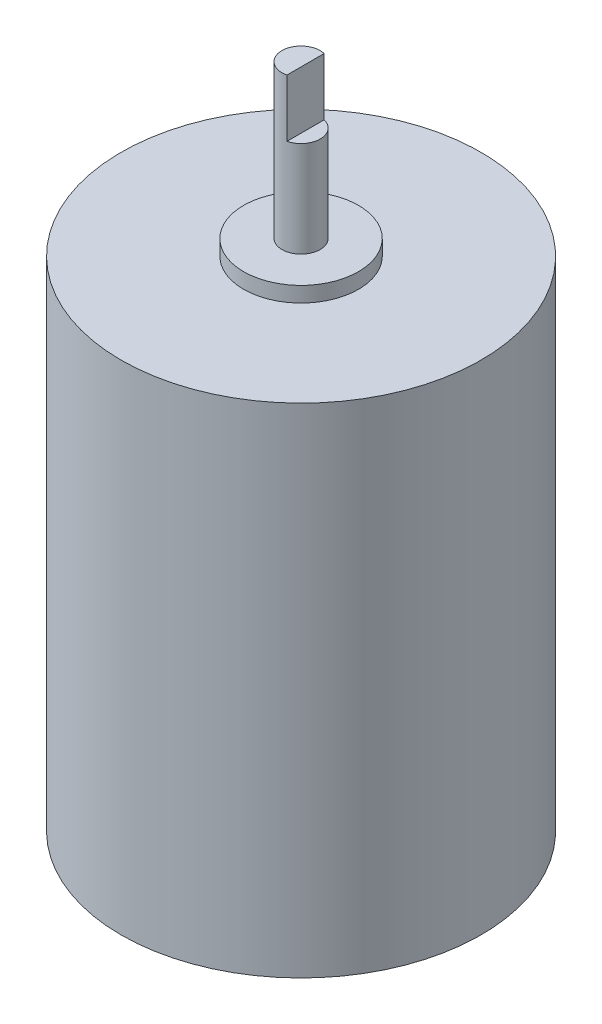
ISO-10303-21;
HEADER;
FILE_DESCRIPTION(('STEP AP214'),'2;1');
FILE_NAME('part.step','',(''),(''),'','','');
FILE_SCHEMA(('AUTOMOTIVE_DESIGN { 1 0 10303 214 1 1 1 1 }'));
ENDSEC;
DATA;
#1=APPLICATION_CONTEXT('core data for automotive mechanical design processes');
#2=APPLICATION_PROTOCOL_DEFINITION('international standard','automotive_design',2000,#1);
#3=PRODUCT_CONTEXT('',#1,'mechanical');
#4=PRODUCT('Part','Part','',(#3));
#5=PRODUCT_RELATED_PRODUCT_CATEGORY('part','',(#4));
#6=PRODUCT_DEFINITION_FORMATION('','',#4);
#7=PRODUCT_DEFINITION_CONTEXT('part definition',#1,'design');
#8=PRODUCT_DEFINITION('design','',#6,#7);
#9=PRODUCT_DEFINITION_SHAPE('','',#8);
#10=(LENGTH_UNIT() NAMED_UNIT(*) SI_UNIT(.MILLI.,.METRE.));
#11=(NAMED_UNIT(*) PLANE_ANGLE_UNIT() SI_UNIT($,.RADIAN.));
#12=(NAMED_UNIT(*) SI_UNIT($,.STERADIAN.) SOLID_ANGLE_UNIT());
#13=UNCERTAINTY_MEASURE_WITH_UNIT(LENGTH_MEASURE(1.E-05),#10,'distance_accuracy_value','');
#14=(GEOMETRIC_REPRESENTATION_CONTEXT(3) GLOBAL_UNCERTAINTY_ASSIGNED_CONTEXT((#13)) GLOBAL_UNIT_ASSIGNED_CONTEXT((#10,
#11,#12)) REPRESENTATION_CONTEXT('',''));
#15=CARTESIAN_POINT('',(0.,0.,0.));
#16=DIRECTION('',(0.,0.,1.));
#17=DIRECTION('',(1.,0.,0.));
#18=AXIS2_PLACEMENT_3D('',#15,#16,#17);
#19=CARTESIAN_POINT('',(0.,65.,0.));
#20=DIRECTION('',(0.,-1.,0.));
#21=DIRECTION('',(0.,0.,-1.));
#22=AXIS2_PLACEMENT_3D('',#19,#20,#21);
#23=CYLINDRICAL_SURFACE('',#22,23.5);
#24=CARTESIAN_POINT('',(0.,65.,0.));
#25=DIRECTION('',(0.,1.,0.));
#26=DIRECTION('',(0.,0.,1.));
#27=AXIS2_PLACEMENT_3D('',#24,#25,#26);
#28=CIRCLE('',#27,23.5);
#29=CARTESIAN_POINT('',(0.,65.,23.5));
#30=VERTEX_POINT('',#29);
#31=EDGE_CURVE('E85',#30,#30,#28,.T.);
#32=ORIENTED_EDGE('',*,*,#31,.F.);
#33=EDGE_LOOP('',(#32));
#34=FACE_BOUND('',#33,.T.);
#35=CARTESIAN_POINT('',(0.,0.,0.));
#36=DIRECTION('',(0.,1.,0.));
#37=DIRECTION('',(0.,0.,1.));
#38=AXIS2_PLACEMENT_3D('',#35,#36,#37);
#39=CIRCLE('',#38,23.5);
#40=CARTESIAN_POINT('',(0.,0.,23.5));
#41=VERTEX_POINT('',#40);
#42=EDGE_CURVE('E40',#41,#41,#39,.T.);
#43=ORIENTED_EDGE('',*,*,#42,.T.);
#44=EDGE_LOOP('',(#43));
#45=FACE_BOUND('',#44,.T.);
#46=ADVANCED_FACE('F37',(#34,#45),#23,.T.);
#47=CARTESIAN_POINT('',(0.,65.,0.));
#48=DIRECTION('',(0.,1.,0.));
#49=DIRECTION('',(0.,0.,1.));
#50=AXIS2_PLACEMENT_3D('',#47,#48,#49);
#51=PLANE('',#50);
#52=CARTESIAN_POINT('',(0.,65.,0.));
#53=DIRECTION('',(0.,1.,0.));
#54=DIRECTION('',(0.,0.,1.));
#55=AXIS2_PLACEMENT_3D('',#52,#53,#54);
#56=CIRCLE('',#55,7.5);
#57=CARTESIAN_POINT('',(0.,65.,7.5));
#58=VERTEX_POINT('',#57);
#59=EDGE_CURVE('E45',#58,#58,#56,.T.);
#60=ORIENTED_EDGE('',*,*,#59,.F.);
#61=EDGE_LOOP('',(#60));
#62=FACE_BOUND('',#61,.T.);
#63=ORIENTED_EDGE('',*,*,#31,.T.);
#64=EDGE_LOOP('',(#63));
#65=FACE_BOUND('',#64,.T.);
#66=ADVANCED_FACE('F96',(#62,#65),#51,.T.);
#67=CARTESIAN_POINT('',(0.,0.,0.));
#68=DIRECTION('',(0.,1.,0.));
#69=DIRECTION('',(0.,0.,1.));
#70=AXIS2_PLACEMENT_3D('',#67,#68,#69);
#71=PLANE('',#70);
#72=ORIENTED_EDGE('',*,*,#42,.F.);
#73=EDGE_LOOP('',(#72));
#74=FACE_BOUND('',#73,.T.);
#75=ADVANCED_FACE('F93',(#74),#71,.F.);
#76=CARTESIAN_POINT('',(0.,67.,0.));
#77=DIRECTION('',(0.,-1.,0.));
#78=DIRECTION('',(0.,0.,-1.));
#79=AXIS2_PLACEMENT_3D('',#76,#77,#78);
#80=CYLINDRICAL_SURFACE('',#79,7.5);
#81=CARTESIAN_POINT('',(0.,67.,0.));
#82=DIRECTION('',(0.,1.,0.));
#83=DIRECTION('',(0.,0.,1.));
#84=AXIS2_PLACEMENT_3D('',#81,#82,#83);
#85=CIRCLE('',#84,7.5);
#86=CARTESIAN_POINT('',(0.,67.,7.5));
#87=VERTEX_POINT('',#86);
#88=EDGE_CURVE('E78',#87,#87,#85,.T.);
#89=ORIENTED_EDGE('',*,*,#88,.F.);
#90=EDGE_LOOP('',(#89));
#91=FACE_BOUND('',#90,.T.);
#92=ORIENTED_EDGE('',*,*,#59,.T.);
#93=EDGE_LOOP('',(#92));
#94=FACE_BOUND('',#93,.T.);
#95=ADVANCED_FACE('F95',(#91,#94),#80,.T.);
#96=CARTESIAN_POINT('',(0.,67.,0.));
#97=DIRECTION('',(0.,1.,0.));
#98=DIRECTION('',(0.,0.,1.));
#99=AXIS2_PLACEMENT_3D('',#96,#97,#98);
#100=PLANE('',#99);
#101=CARTESIAN_POINT('',(0.,67.,0.));
#102=DIRECTION('',(0.,1.,0.));
#103=DIRECTION('',(0.,0.,1.));
#104=AXIS2_PLACEMENT_3D('',#101,#102,#103);
#105=CIRCLE('',#104,2.5);
#106=CARTESIAN_POINT('',(0.,67.,2.5));
#107=VERTEX_POINT('',#106);
#108=EDGE_CURVE('E11',#107,#107,#105,.T.);
#109=ORIENTED_EDGE('',*,*,#108,.F.);
#110=EDGE_LOOP('',(#109));
#111=FACE_BOUND('',#110,.T.);
#112=ORIENTED_EDGE('',*,*,#88,.T.);
#113=EDGE_LOOP('',(#112));
#114=FACE_BOUND('',#113,.T.);
#115=ADVANCED_FACE('F101',(#111,#114),#100,.T.);
#116=CARTESIAN_POINT('',(0.,87.,0.));
#117=DIRECTION('',(0.,-1.,0.));
#118=DIRECTION('',(0.,0.,-1.));
#119=AXIS2_PLACEMENT_3D('',#116,#117,#118);
#120=CYLINDRICAL_SURFACE('',#119,2.5);
#121=CARTESIAN_POINT('',(0.,87.,0.));
#122=DIRECTION('',(0.,1.,0.));
#123=DIRECTION('',(0.,0.,1.));
#124=AXIS2_PLACEMENT_3D('',#121,#122,#123);
#125=CIRCLE('',#124,2.5);
#126=CARTESIAN_POINT('',(0.591953548733058,87.,-2.42890736672734));
#127=VERTEX_POINT('',#126);
#128=CARTESIAN_POINT('',(0.591953548733058,87.,2.42890736672734));
#129=VERTEX_POINT('',#128);
#130=EDGE_CURVE('E75',#127,#129,#125,.T.);
#131=ORIENTED_EDGE('',*,*,#130,.F.);
#132=DIRECTION('',(0.,1.,0.));
#133=VECTOR('',#132,1.);
#134=CARTESIAN_POINT('',(0.591953548733058,79.5,-2.42890736672734));
#135=LINE('',#134,#133);
#136=CARTESIAN_POINT('',(0.591953548733058,79.5,-2.42890736672734));
#137=VERTEX_POINT('',#136);
#138=EDGE_CURVE('E53',#137,#127,#135,.T.);
#139=ORIENTED_EDGE('',*,*,#138,.F.);
#140=CARTESIAN_POINT('',(0.,79.5,0.));
#141=DIRECTION('',(0.,1.,0.));
#142=DIRECTION('',(0.,0.,-1.));
#143=AXIS2_PLACEMENT_3D('',#140,#141,#142);
#144=CIRCLE('',#143,2.5);
#145=CARTESIAN_POINT('',(0.591953548733058,79.5,2.42890736672734));
#146=VERTEX_POINT('',#145);
#147=EDGE_CURVE('E69',#146,#137,#144,.T.);
#148=ORIENTED_EDGE('',*,*,#147,.F.);
#149=DIRECTION('',(0.,1.,0.));
#150=VECTOR('',#149,1.);
#151=CARTESIAN_POINT('',(0.591953548733058,79.5,2.42890736672734));
#152=LINE('',#151,#150);
#153=EDGE_CURVE('E59',#146,#129,#152,.T.);
#154=ORIENTED_EDGE('',*,*,#153,.T.);
#155=EDGE_LOOP('',(#131,#139,#148,#154));
#156=FACE_BOUND('',#155,.T.);
#157=ORIENTED_EDGE('',*,*,#108,.T.);
#158=EDGE_LOOP('',(#157));
#159=FACE_BOUND('',#158,.T.);
#160=ADVANCED_FACE('F73',(#156,#159),#120,.T.);
#161=CARTESIAN_POINT('',(0.,87.,0.));
#162=DIRECTION('',(0.,1.,0.));
#163=DIRECTION('',(0.,0.,1.));
#164=AXIS2_PLACEMENT_3D('',#161,#162,#163);
#165=PLANE('',#164);
#166=DIRECTION('',(0.,0.,1.));
#167=VECTOR('',#166,1.);
#168=CARTESIAN_POINT('',(0.591953548733058,87.,-2.42890736672734));
#169=LINE('',#168,#167);
#170=EDGE_CURVE('E64',#127,#129,#169,.T.);
#171=ORIENTED_EDGE('',*,*,#170,.F.);
#172=ORIENTED_EDGE('',*,*,#130,.T.);
#173=EDGE_LOOP('',(#171,#172));
#174=FACE_BOUND('',#173,.T.);
#175=ADVANCED_FACE('F77',(#174),#165,.T.);
#176=CARTESIAN_POINT('',(0.591953548733058,79.5,-2.42890736672734));
#177=DIRECTION('',(-1.,0.,0.));
#178=DIRECTION('',(0.,0.,1.));
#179=AXIS2_PLACEMENT_3D('',#176,#177,#178);
#180=PLANE('',#179);
#181=ORIENTED_EDGE('',*,*,#170,.T.);
#182=ORIENTED_EDGE('',*,*,#153,.F.);
#183=DIRECTION('',(0.,0.,1.));
#184=VECTOR('',#183,1.);
#185=CARTESIAN_POINT('',(0.591953548733058,79.5,-2.42890736672734));
#186=LINE('',#185,#184);
#187=EDGE_CURVE('E170',#137,#146,#186,.T.);
#188=ORIENTED_EDGE('',*,*,#187,.F.);
#189=ORIENTED_EDGE('',*,*,#138,.T.);
#190=EDGE_LOOP('',(#181,#182,#188,#189));
#191=FACE_BOUND('',#190,.T.);
#192=ADVANCED_FACE('F65',(#191),#180,.F.);
#193=CARTESIAN_POINT('',(0.,79.5,0.));
#194=DIRECTION('',(0.,-1.,0.));
#195=DIRECTION('',(0.,0.,-1.));
#196=AXIS2_PLACEMENT_3D('',#193,#194,#195);
#197=PLANE('',#196);
#198=ORIENTED_EDGE('',*,*,#147,.T.);
#199=ORIENTED_EDGE('',*,*,#187,.T.);
#200=EDGE_LOOP('',(#198,#199));
#201=FACE_BOUND('',#200,.T.);
#202=ADVANCED_FACE('F157',(#201),#197,.F.);
#203=CLOSED_SHELL('',(#46,#66,#75,#95,#115,#160,#175,#192,#202));
#204=MANIFOLD_SOLID_BREP('B2',#203);
#205=ADVANCED_BREP_SHAPE_REPRESENTATION('',(#18,#204),#14);
#206=SHAPE_DEFINITION_REPRESENTATION(#9,#205);
ENDSEC;
END-ISO-10303-21;
